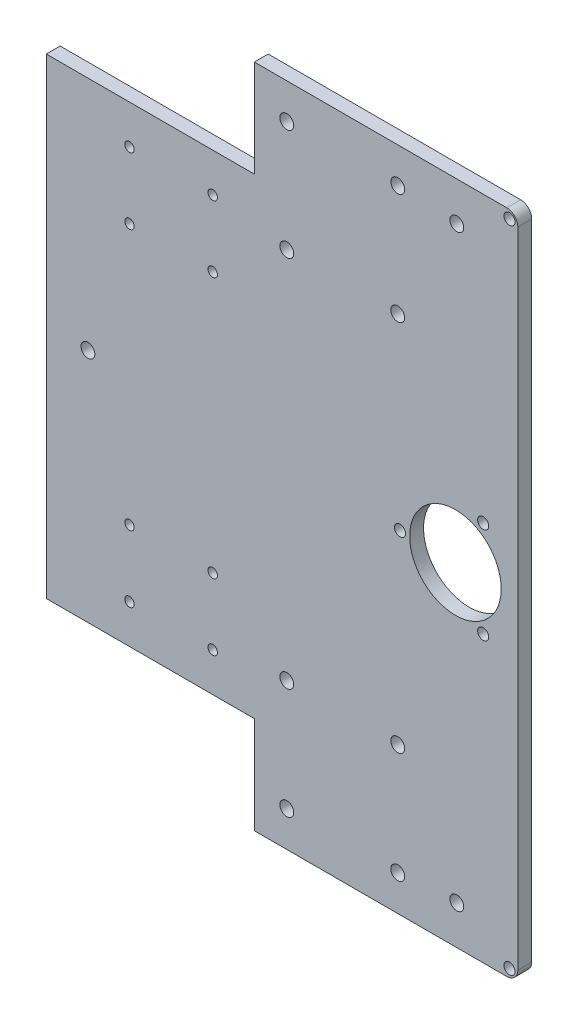
ISO-10303-21;
HEADER;
FILE_DESCRIPTION(('STEP AP214'),'2;1');
FILE_NAME('part.step','',(''),(''),'','','');
FILE_SCHEMA(('AUTOMOTIVE_DESIGN { 1 0 10303 214 1 1 1 1 }'));
ENDSEC;
DATA;
#1=APPLICATION_CONTEXT('core data for automotive mechanical design processes');
#2=APPLICATION_PROTOCOL_DEFINITION('international standard','automotive_design',2000,#1);
#3=PRODUCT_CONTEXT('',#1,'mechanical');
#4=PRODUCT('Part','Part','',(#3));
#5=PRODUCT_RELATED_PRODUCT_CATEGORY('part','',(#4));
#6=PRODUCT_DEFINITION_FORMATION('','',#4);
#7=PRODUCT_DEFINITION_CONTEXT('part definition',#1,'design');
#8=PRODUCT_DEFINITION('design','',#6,#7);
#9=PRODUCT_DEFINITION_SHAPE('','',#8);
#10=(LENGTH_UNIT() NAMED_UNIT(*) SI_UNIT(.MILLI.,.METRE.));
#11=(NAMED_UNIT(*) PLANE_ANGLE_UNIT() SI_UNIT($,.RADIAN.));
#12=(NAMED_UNIT(*) SI_UNIT($,.STERADIAN.) SOLID_ANGLE_UNIT());
#13=UNCERTAINTY_MEASURE_WITH_UNIT(LENGTH_MEASURE(1.E-05),#10,'distance_accuracy_value','');
#14=(GEOMETRIC_REPRESENTATION_CONTEXT(3) GLOBAL_UNCERTAINTY_ASSIGNED_CONTEXT((#13)) GLOBAL_UNIT_ASSIGNED_CONTEXT((#10,
#11,#12)) REPRESENTATION_CONTEXT('',''));
#15=CARTESIAN_POINT('',(0.,0.,0.));
#16=DIRECTION('',(0.,0.,1.));
#17=DIRECTION('',(1.,0.,0.));
#18=AXIS2_PLACEMENT_3D('',#15,#16,#17);
#19=CARTESIAN_POINT('',(85.,120.,5.));
#20=DIRECTION('',(-1.,0.,0.));
#21=DIRECTION('',(0.,0.,1.));
#22=AXIS2_PLACEMENT_3D('',#19,#20,#21);
#23=PLANE('',#22);
#24=DIRECTION('',(0.,1.,0.));
#25=VECTOR('',#24,1.);
#26=CARTESIAN_POINT('',(85.,120.,0.));
#27=LINE('',#26,#25);
#28=CARTESIAN_POINT('',(85.,-116.,0.));
#29=VERTEX_POINT('',#28);
#30=CARTESIAN_POINT('',(85.,116.,0.));
#31=VERTEX_POINT('',#30);
#32=EDGE_CURVE('E119',#29,#31,#27,.T.);
#33=ORIENTED_EDGE('',*,*,#32,.T.);
#34=DIRECTION('',(0.,0.,-1.));
#35=VECTOR('',#34,1.);
#36=CARTESIAN_POINT('',(85.,116.,5.));
#37=LINE('',#36,#35);
#38=CARTESIAN_POINT('',(85.,116.,5.));
#39=VERTEX_POINT('',#38);
#40=EDGE_CURVE('E41',#31,#39,#37,.F.);
#41=ORIENTED_EDGE('',*,*,#40,.T.);
#42=DIRECTION('',(0.,1.,0.));
#43=VECTOR('',#42,1.);
#44=CARTESIAN_POINT('',(85.,120.,5.));
#45=LINE('',#44,#43);
#46=CARTESIAN_POINT('',(85.,-116.,5.));
#47=VERTEX_POINT('',#46);
#48=EDGE_CURVE('E238',#47,#39,#45,.T.);
#49=ORIENTED_EDGE('',*,*,#48,.F.);
#50=DIRECTION('',(0.,0.,-1.));
#51=VECTOR('',#50,1.);
#52=CARTESIAN_POINT('',(85.,-116.,5.));
#53=LINE('',#52,#51);
#54=EDGE_CURVE('E249',#47,#29,#53,.T.);
#55=ORIENTED_EDGE('',*,*,#54,.T.);
#56=EDGE_LOOP('',(#33,#41,#49,#55));
#57=FACE_BOUND('',#56,.T.);
#58=ADVANCED_FACE('F33',(#57),#23,.F.);
#59=CARTESIAN_POINT('',(-85.,120.,5.));
#60=DIRECTION('',(0.,-1.,0.));
#61=DIRECTION('',(0.,0.,-1.));
#62=AXIS2_PLACEMENT_3D('',#59,#60,#61);
#63=PLANE('',#62);
#64=DIRECTION('',(-1.,0.,0.));
#65=VECTOR('',#64,1.);
#66=CARTESIAN_POINT('',(-85.,120.,5.));
#67=LINE('',#66,#65);
#68=CARTESIAN_POINT('',(81.,120.,5.));
#69=VERTEX_POINT('',#68);
#70=CARTESIAN_POINT('',(-10.,120.,5.));
#71=VERTEX_POINT('',#70);
#72=EDGE_CURVE('E240',#69,#71,#67,.T.);
#73=ORIENTED_EDGE('',*,*,#72,.F.);
#74=DIRECTION('',(0.,0.,-1.));
#75=VECTOR('',#74,1.);
#76=CARTESIAN_POINT('',(81.,120.,5.));
#77=LINE('',#76,#75);
#78=CARTESIAN_POINT('',(81.,120.,0.));
#79=VERTEX_POINT('',#78);
#80=EDGE_CURVE('E116',#69,#79,#77,.T.);
#81=ORIENTED_EDGE('',*,*,#80,.T.);
#82=DIRECTION('',(-1.,0.,0.));
#83=VECTOR('',#82,1.);
#84=CARTESIAN_POINT('',(-85.,120.,0.));
#85=LINE('',#84,#83);
#86=CARTESIAN_POINT('',(-10.,120.,0.));
#87=VERTEX_POINT('',#86);
#88=EDGE_CURVE('E110',#79,#87,#85,.T.);
#89=ORIENTED_EDGE('',*,*,#88,.T.);
#90=DIRECTION('',(0.,0.,1.));
#91=VECTOR('',#90,1.);
#92=CARTESIAN_POINT('',(-10.,120.,0.));
#93=LINE('',#92,#91);
#94=EDGE_CURVE('E114',#87,#71,#93,.T.);
#95=ORIENTED_EDGE('',*,*,#94,.T.);
#96=EDGE_LOOP('',(#73,#81,#89,#95));
#97=FACE_BOUND('',#96,.T.);
#98=ADVANCED_FACE('F113',(#97),#63,.F.);
#99=CARTESIAN_POINT('',(-85.,120.,5.));
#100=DIRECTION('',(1.,0.,0.));
#101=DIRECTION('',(0.,1.,0.));
#102=AXIS2_PLACEMENT_3D('',#99,#100,#101);
#103=PLANE('',#102);
#104=DIRECTION('',(0.,-1.,0.));
#105=VECTOR('',#104,1.);
#106=CARTESIAN_POINT('',(-85.,120.,5.));
#107=LINE('',#106,#105);
#108=CARTESIAN_POINT('',(-85.,85.,5.));
#109=VERTEX_POINT('',#108);
#110=CARTESIAN_POINT('',(-85.,-85.,5.));
#111=VERTEX_POINT('',#110);
#112=EDGE_CURVE('E243',#109,#111,#107,.T.);
#113=ORIENTED_EDGE('',*,*,#112,.F.);
#114=DIRECTION('',(0.,0.,1.));
#115=VECTOR('',#114,1.);
#116=CARTESIAN_POINT('',(-85.,85.,0.));
#117=LINE('',#116,#115);
#118=CARTESIAN_POINT('',(-85.,85.,0.));
#119=VERTEX_POINT('',#118);
#120=EDGE_CURVE('E128',#119,#109,#117,.T.);
#121=ORIENTED_EDGE('',*,*,#120,.F.);
#122=DIRECTION('',(0.,-1.,0.));
#123=VECTOR('',#122,1.);
#124=CARTESIAN_POINT('',(-85.,120.,0.));
#125=LINE('',#124,#123);
#126=CARTESIAN_POINT('',(-85.,-85.,0.));
#127=VERTEX_POINT('',#126);
#128=EDGE_CURVE('E118',#119,#127,#125,.T.);
#129=ORIENTED_EDGE('',*,*,#128,.T.);
#130=DIRECTION('',(0.,0.,1.));
#131=VECTOR('',#130,1.);
#132=CARTESIAN_POINT('',(-85.,-85.,0.));
#133=LINE('',#132,#131);
#134=EDGE_CURVE('E163',#127,#111,#133,.T.);
#135=ORIENTED_EDGE('',*,*,#134,.T.);
#136=EDGE_LOOP('',(#113,#121,#129,#135));
#137=FACE_BOUND('',#136,.T.);
#138=ADVANCED_FACE('F288',(#137),#103,.F.);
#139=CARTESIAN_POINT('',(-85.,-120.,5.));
#140=DIRECTION('',(0.,1.,0.));
#141=DIRECTION('',(0.,0.,1.));
#142=AXIS2_PLACEMENT_3D('',#139,#140,#141);
#143=PLANE('',#142);
#144=DIRECTION('',(1.,0.,0.));
#145=VECTOR('',#144,1.);
#146=CARTESIAN_POINT('',(-85.,-120.,0.));
#147=LINE('',#146,#145);
#148=CARTESIAN_POINT('',(-10.,-120.,0.));
#149=VERTEX_POINT('',#148);
#150=CARTESIAN_POINT('',(81.,-120.,0.));
#151=VERTEX_POINT('',#150);
#152=EDGE_CURVE('E241',#149,#151,#147,.T.);
#153=ORIENTED_EDGE('',*,*,#152,.T.);
#154=DIRECTION('',(0.,0.,-1.));
#155=VECTOR('',#154,1.);
#156=CARTESIAN_POINT('',(81.,-120.,5.));
#157=LINE('',#156,#155);
#158=CARTESIAN_POINT('',(81.,-120.,5.));
#159=VERTEX_POINT('',#158);
#160=EDGE_CURVE('E259',#151,#159,#157,.F.);
#161=ORIENTED_EDGE('',*,*,#160,.T.);
#162=DIRECTION('',(1.,0.,0.));
#163=VECTOR('',#162,1.);
#164=CARTESIAN_POINT('',(-85.,-120.,5.));
#165=LINE('',#164,#163);
#166=CARTESIAN_POINT('',(-10.,-120.,5.));
#167=VERTEX_POINT('',#166);
#168=EDGE_CURVE('E246',#167,#159,#165,.T.);
#169=ORIENTED_EDGE('',*,*,#168,.F.);
#170=DIRECTION('',(0.,0.,1.));
#171=VECTOR('',#170,1.);
#172=CARTESIAN_POINT('',(-10.,-120.,0.));
#173=LINE('',#172,#171);
#174=EDGE_CURVE('E143',#149,#167,#173,.T.);
#175=ORIENTED_EDGE('',*,*,#174,.F.);
#176=EDGE_LOOP('',(#153,#161,#169,#175));
#177=FACE_BOUND('',#176,.T.);
#178=ADVANCED_FACE('F278',(#177),#143,.F.);
#179=CARTESIAN_POINT('',(0.,0.,5.));
#180=DIRECTION('',(0.,0.,1.));
#181=DIRECTION('',(1.,0.,0.));
#182=AXIS2_PLACEMENT_3D('',#179,#180,#181);
#183=PLANE('',#182);
#184=CARTESIAN_POINT('',(62.9999999999836,105.99999999999,5.));
#185=DIRECTION('',(0.,0.,-1.));
#186=DIRECTION('',(-1.,0.,0.));
#187=AXIS2_PLACEMENT_3D('',#184,#185,#186);
#188=CIRCLE('',#187,2.49999999998859);
#189=CARTESIAN_POINT('',(60.499999999995,105.99999999999,5.));
#190=VERTEX_POINT('',#189);
#191=EDGE_CURVE('E596',#190,#190,#188,.T.);
#192=ORIENTED_EDGE('',*,*,#191,.T.);
#193=EDGE_LOOP('',(#192));
#194=FACE_BOUND('',#193,.T.);
#195=CARTESIAN_POINT('',(62.9999999999836,-105.99999999999,5.));
#196=DIRECTION('',(0.,0.,-1.));
#197=DIRECTION('',(-1.,0.,0.));
#198=AXIS2_PLACEMENT_3D('',#195,#196,#197);
#199=CIRCLE('',#198,2.5);
#200=CARTESIAN_POINT('',(60.4999999999836,-105.99999999999,5.));
#201=VERTEX_POINT('',#200);
#202=EDGE_CURVE('E600',#201,#201,#199,.T.);
#203=ORIENTED_EDGE('',*,*,#202,.T.);
#204=EDGE_LOOP('',(#203));
#205=FACE_BOUND('',#204,.T.);
#206=CARTESIAN_POINT('',(-69.9999999999836,-3.0158167629857E-12,5.));
#207=DIRECTION('',(0.,0.,-1.));
#208=DIRECTION('',(-1.,0.,0.));
#209=AXIS2_PLACEMENT_3D('',#206,#207,#208);
#210=CIRCLE('',#209,2.50000000000001);
#211=CARTESIAN_POINT('',(-72.4999999999836,-3.0158167629857E-12,5.));
#212=VERTEX_POINT('',#211);
#213=EDGE_CURVE('E610',#212,#212,#210,.T.);
#214=ORIENTED_EDGE('',*,*,#213,.T.);
#215=EDGE_LOOP('',(#214));
#216=FACE_BOUND('',#215,.T.);
#217=CARTESIAN_POINT('',(41.7,-107.25,5.));
#218=DIRECTION('',(0.,0.,1.));
#219=DIRECTION('',(1.,0.,0.));
#220=AXIS2_PLACEMENT_3D('',#217,#218,#219);
#221=CIRCLE('',#220,2.50000000000003);
#222=CARTESIAN_POINT('',(44.2,-107.25,5.));
#223=VERTEX_POINT('',#222);
#224=EDGE_CURVE('E619',#223,#223,#221,.T.);
#225=ORIENTED_EDGE('',*,*,#224,.F.);
#226=EDGE_LOOP('',(#225));
#227=FACE_BOUND('',#226,.T.);
#228=CARTESIAN_POINT('',(1.7,107.25,5.));
#229=DIRECTION('',(0.,0.,1.));
#230=DIRECTION('',(1.,0.,0.));
#231=AXIS2_PLACEMENT_3D('',#228,#229,#230);
#232=CIRCLE('',#231,2.5);
#233=CARTESIAN_POINT('',(4.2,107.25,5.));
#234=VERTEX_POINT('',#233);
#235=EDGE_CURVE('E638',#234,#234,#232,.T.);
#236=ORIENTED_EDGE('',*,*,#235,.F.);
#237=EDGE_LOOP('',(#236));
#238=FACE_BOUND('',#237,.T.);
#239=CARTESIAN_POINT('',(1.7,67.25,5.));
#240=DIRECTION('',(0.,0.,1.));
#241=DIRECTION('',(1.,0.,0.));
#242=AXIS2_PLACEMENT_3D('',#239,#240,#241);
#243=CIRCLE('',#242,2.5);
#244=CARTESIAN_POINT('',(4.2,67.25,5.));
#245=VERTEX_POINT('',#244);
#246=EDGE_CURVE('E637',#245,#245,#243,.T.);
#247=ORIENTED_EDGE('',*,*,#246,.F.);
#248=EDGE_LOOP('',(#247));
#249=FACE_BOUND('',#248,.T.);
#250=CARTESIAN_POINT('',(41.7,67.25,5.));
#251=DIRECTION('',(0.,0.,1.));
#252=DIRECTION('',(1.,0.,0.));
#253=AXIS2_PLACEMENT_3D('',#250,#251,#252);
#254=CIRCLE('',#253,2.5);
#255=CARTESIAN_POINT('',(44.2,67.25,5.));
#256=VERTEX_POINT('',#255);
#257=EDGE_CURVE('E650',#256,#256,#254,.T.);
#258=ORIENTED_EDGE('',*,*,#257,.F.);
#259=EDGE_LOOP('',(#258));
#260=FACE_BOUND('',#259,.T.);
#261=CARTESIAN_POINT('',(1.70000000000001,-107.25,5.));
#262=DIRECTION('',(0.,0.,1.));
#263=DIRECTION('',(1.,0.,0.));
#264=AXIS2_PLACEMENT_3D('',#261,#262,#263);
#265=CIRCLE('',#264,2.50000000000003);
#266=CARTESIAN_POINT('',(4.20000000000004,-107.25,5.));
#267=VERTEX_POINT('',#266);
#268=EDGE_CURVE('E620',#267,#267,#265,.T.);
#269=ORIENTED_EDGE('',*,*,#268,.F.);
#270=EDGE_LOOP('',(#269));
#271=FACE_BOUND('',#270,.T.);
#272=CARTESIAN_POINT('',(1.70000000000001,-67.2499999999999,5.));
#273=DIRECTION('',(0.,0.,1.));
#274=DIRECTION('',(1.,0.,0.));
#275=AXIS2_PLACEMENT_3D('',#272,#273,#274);
#276=CIRCLE('',#275,2.50000000000003);
#277=CARTESIAN_POINT('',(4.20000000000004,-67.2499999999999,5.));
#278=VERTEX_POINT('',#277);
#279=EDGE_CURVE('E626',#278,#278,#276,.T.);
#280=ORIENTED_EDGE('',*,*,#279,.F.);
#281=EDGE_LOOP('',(#280));
#282=FACE_BOUND('',#281,.T.);
#283=CARTESIAN_POINT('',(41.7,-67.2499999999999,5.));
#284=DIRECTION('',(0.,0.,1.));
#285=DIRECTION('',(1.,0.,0.));
#286=AXIS2_PLACEMENT_3D('',#283,#284,#285);
#287=CIRCLE('',#286,2.50000000000003);
#288=CARTESIAN_POINT('',(44.2,-67.2499999999999,5.));
#289=VERTEX_POINT('',#288);
#290=EDGE_CURVE('E602',#289,#289,#287,.T.);
#291=ORIENTED_EDGE('',*,*,#290,.F.);
#292=EDGE_LOOP('',(#291));
#293=FACE_BOUND('',#292,.T.);
#294=CARTESIAN_POINT('',(41.7,107.25,5.));
#295=DIRECTION('',(0.,0.,1.));
#296=DIRECTION('',(1.,0.,0.));
#297=AXIS2_PLACEMENT_3D('',#294,#295,#296);
#298=CIRCLE('',#297,2.5);
#299=CARTESIAN_POINT('',(44.2,107.25,5.));
#300=VERTEX_POINT('',#299);
#301=EDGE_CURVE('E649',#300,#300,#298,.T.);
#302=ORIENTED_EDGE('',*,*,#301,.F.);
#303=EDGE_LOOP('',(#302));
#304=FACE_BOUND('',#303,.T.);
#305=CARTESIAN_POINT('',(81.9999999993819,117.,5.));
#306=DIRECTION('',(0.,0.,-1.));
#307=DIRECTION('',(1.,0.,0.));
#308=AXIS2_PLACEMENT_3D('',#305,#306,#307);
#309=CIRCLE('',#308,2.0000000005911);
#310=CARTESIAN_POINT('',(83.999999999973,117.,5.));
#311=VERTEX_POINT('',#310);
#312=EDGE_CURVE('E661',#311,#311,#309,.T.);
#313=ORIENTED_EDGE('',*,*,#312,.T.);
#314=EDGE_LOOP('',(#313));
#315=FACE_BOUND('',#314,.T.);
#316=CARTESIAN_POINT('',(81.9999999993819,-117.,5.));
#317=DIRECTION('',(0.,0.,1.));
#318=DIRECTION('',(1.,0.,0.));
#319=AXIS2_PLACEMENT_3D('',#316,#317,#318);
#320=CIRCLE('',#319,2.0000000005911);
#321=CARTESIAN_POINT('',(83.999999999973,-117.,5.));
#322=VERTEX_POINT('',#321);
#323=EDGE_CURVE('E140',#322,#322,#320,.T.);
#324=ORIENTED_EDGE('',*,*,#323,.F.);
#325=EDGE_LOOP('',(#324));
#326=FACE_BOUND('',#325,.T.);
#327=ORIENTED_EDGE('',*,*,#48,.T.);
#328=CARTESIAN_POINT('',(81.,116.,5.));
#329=DIRECTION('',(0.,0.,1.));
#330=DIRECTION('',(1.,0.,0.));
#331=AXIS2_PLACEMENT_3D('',#328,#329,#330);
#332=CIRCLE('',#331,4.);
#333=EDGE_CURVE('E11',#39,#69,#332,.T.);
#334=ORIENTED_EDGE('',*,*,#333,.T.);
#335=ORIENTED_EDGE('',*,*,#72,.T.);
#336=DIRECTION('',(0.,1.,0.));
#337=VECTOR('',#336,1.);
#338=CARTESIAN_POINT('',(-10.,120.,5.));
#339=LINE('',#338,#337);
#340=CARTESIAN_POINT('',(-10.,85.,5.));
#341=VERTEX_POINT('',#340);
#342=EDGE_CURVE('E127',#341,#71,#339,.T.);
#343=ORIENTED_EDGE('',*,*,#342,.F.);
#344=DIRECTION('',(1.,0.,0.));
#345=VECTOR('',#344,1.);
#346=CARTESIAN_POINT('',(-10.,85.,5.));
#347=LINE('',#346,#345);
#348=EDGE_CURVE('E134',#109,#341,#347,.T.);
#349=ORIENTED_EDGE('',*,*,#348,.F.);
#350=ORIENTED_EDGE('',*,*,#112,.T.);
#351=DIRECTION('',(-1.,0.,0.));
#352=VECTOR('',#351,1.);
#353=CARTESIAN_POINT('',(-10.,-85.,5.));
#354=LINE('',#353,#352);
#355=CARTESIAN_POINT('',(-10.,-85.,5.));
#356=VERTEX_POINT('',#355);
#357=EDGE_CURVE('E153',#356,#111,#354,.T.);
#358=ORIENTED_EDGE('',*,*,#357,.F.);
#359=DIRECTION('',(0.,1.,0.));
#360=VECTOR('',#359,1.);
#361=CARTESIAN_POINT('',(-10.,-120.,5.));
#362=LINE('',#361,#360);
#363=EDGE_CURVE('E157',#167,#356,#362,.T.);
#364=ORIENTED_EDGE('',*,*,#363,.F.);
#365=ORIENTED_EDGE('',*,*,#168,.T.);
#366=CARTESIAN_POINT('',(81.,-116.,5.));
#367=DIRECTION('',(0.,0.,1.));
#368=DIRECTION('',(1.,0.,0.));
#369=AXIS2_PLACEMENT_3D('',#366,#367,#368);
#370=CIRCLE('',#369,4.);
#371=EDGE_CURVE('E261',#159,#47,#370,.T.);
#372=ORIENTED_EDGE('',*,*,#371,.T.);
#373=EDGE_LOOP('',(#327,#334,#335,#343,#349,#350,#358,#364,#365,#372));
#374=FACE_BOUND('',#373,.T.);
#375=CARTESIAN_POINT('',(-55.,-71.,5.));
#376=DIRECTION('',(0.,0.,1.));
#377=DIRECTION('',(-1.,0.,0.));
#378=AXIS2_PLACEMENT_3D('',#375,#376,#377);
#379=CIRCLE('',#378,1.70000000000013);
#380=CARTESIAN_POINT('',(-56.7000000000002,-71.,5.));
#381=VERTEX_POINT('',#380);
#382=EDGE_CURVE('E176',#381,#381,#379,.T.);
#383=ORIENTED_EDGE('',*,*,#382,.F.);
#384=EDGE_LOOP('',(#383));
#385=FACE_BOUND('',#384,.T.);
#386=CARTESIAN_POINT('',(-55.,71.,5.));
#387=DIRECTION('',(0.,0.,1.));
#388=DIRECTION('',(1.,0.,0.));
#389=AXIS2_PLACEMENT_3D('',#386,#387,#388);
#390=CIRCLE('',#389,1.7000000000001);
#391=CARTESIAN_POINT('',(-53.2999999999999,71.,5.));
#392=VERTEX_POINT('',#391);
#393=EDGE_CURVE('E189',#392,#392,#390,.T.);
#394=ORIENTED_EDGE('',*,*,#393,.F.);
#395=EDGE_LOOP('',(#394));
#396=FACE_BOUND('',#395,.T.);
#397=CARTESIAN_POINT('',(-55.,47.,5.));
#398=DIRECTION('',(0.,0.,1.));
#399=DIRECTION('',(1.,0.,0.));
#400=AXIS2_PLACEMENT_3D('',#397,#398,#399);
#401=CIRCLE('',#400,1.7000000000001);
#402=CARTESIAN_POINT('',(-53.3,47.,5.));
#403=VERTEX_POINT('',#402);
#404=EDGE_CURVE('E188',#403,#403,#401,.T.);
#405=ORIENTED_EDGE('',*,*,#404,.F.);
#406=EDGE_LOOP('',(#405));
#407=FACE_BOUND('',#406,.T.);
#408=CARTESIAN_POINT('',(-25.,71.,5.));
#409=DIRECTION('',(0.,0.,1.));
#410=DIRECTION('',(1.,0.,0.));
#411=AXIS2_PLACEMENT_3D('',#408,#409,#410);
#412=CIRCLE('',#411,1.70000000000012);
#413=CARTESIAN_POINT('',(-23.2999999999999,71.,5.));
#414=VERTEX_POINT('',#413);
#415=EDGE_CURVE('E201',#414,#414,#412,.T.);
#416=ORIENTED_EDGE('',*,*,#415,.F.);
#417=EDGE_LOOP('',(#416));
#418=FACE_BOUND('',#417,.T.);
#419=CARTESIAN_POINT('',(-25.0000000000001,-47.,5.));
#420=DIRECTION('',(0.,0.,1.));
#421=DIRECTION('',(-1.,0.,0.));
#422=AXIS2_PLACEMENT_3D('',#419,#420,#421);
#423=CIRCLE('',#422,1.70000000000016);
#424=CARTESIAN_POINT('',(-26.7000000000002,-47.,5.));
#425=VERTEX_POINT('',#424);
#426=EDGE_CURVE('E147',#425,#425,#423,.T.);
#427=ORIENTED_EDGE('',*,*,#426,.F.);
#428=EDGE_LOOP('',(#427));
#429=FACE_BOUND('',#428,.T.);
#430=CARTESIAN_POINT('',(-55.,-47.,5.));
#431=DIRECTION('',(0.,0.,1.));
#432=DIRECTION('',(-1.,0.,0.));
#433=AXIS2_PLACEMENT_3D('',#430,#431,#432);
#434=CIRCLE('',#433,1.70000000000013);
#435=CARTESIAN_POINT('',(-56.7000000000002,-47.,5.));
#436=VERTEX_POINT('',#435);
#437=EDGE_CURVE('E170',#436,#436,#434,.T.);
#438=ORIENTED_EDGE('',*,*,#437,.F.);
#439=EDGE_LOOP('',(#438));
#440=FACE_BOUND('',#439,.T.);
#441=CARTESIAN_POINT('',(-25.,-71.,5.));
#442=DIRECTION('',(0.,0.,1.));
#443=DIRECTION('',(-1.,0.,0.));
#444=AXIS2_PLACEMENT_3D('',#441,#442,#443);
#445=CIRCLE('',#444,1.70000000000015);
#446=CARTESIAN_POINT('',(-26.7000000000002,-71.,5.));
#447=VERTEX_POINT('',#446);
#448=EDGE_CURVE('E177',#447,#447,#445,.T.);
#449=ORIENTED_EDGE('',*,*,#448,.F.);
#450=EDGE_LOOP('',(#449));
#451=FACE_BOUND('',#450,.T.);
#452=CARTESIAN_POINT('',(-25.0000000000001,47.,5.));
#453=DIRECTION('',(0.,0.,1.));
#454=DIRECTION('',(1.,0.,0.));
#455=AXIS2_PLACEMENT_3D('',#452,#453,#454);
#456=CIRCLE('',#455,1.70000000000013);
#457=CARTESIAN_POINT('',(-23.2999999999999,47.,5.));
#458=VERTEX_POINT('',#457);
#459=EDGE_CURVE('E200',#458,#458,#456,.T.);
#460=ORIENTED_EDGE('',*,*,#459,.F.);
#461=EDGE_LOOP('',(#460));
#462=FACE_BOUND('',#461,.T.);
#463=CARTESIAN_POINT('',(72.5,-17.3205080756889,5.));
#464=DIRECTION('',(0.,0.,1.));
#465=DIRECTION('',(1.,0.,0.));
#466=AXIS2_PLACEMENT_3D('',#463,#464,#465);
#467=CIRCLE('',#466,2.00000000000001);
#468=CARTESIAN_POINT('',(74.5,-17.3205080756889,5.));
#469=VERTEX_POINT('',#468);
#470=EDGE_CURVE('E219',#469,#469,#467,.T.);
#471=ORIENTED_EDGE('',*,*,#470,.F.);
#472=EDGE_LOOP('',(#471));
#473=FACE_BOUND('',#472,.T.);
#474=CARTESIAN_POINT('',(72.5,17.3205080756887,5.));
#475=DIRECTION('',(0.,0.,1.));
#476=DIRECTION('',(1.,0.,0.));
#477=AXIS2_PLACEMENT_3D('',#474,#475,#476);
#478=CIRCLE('',#477,2.);
#479=CARTESIAN_POINT('',(74.5,17.3205080756887,5.));
#480=VERTEX_POINT('',#479);
#481=EDGE_CURVE('E225',#480,#480,#478,.T.);
#482=ORIENTED_EDGE('',*,*,#481,.F.);
#483=EDGE_LOOP('',(#482));
#484=FACE_BOUND('',#483,.T.);
#485=CARTESIAN_POINT('',(42.5,0.,5.));
#486=DIRECTION('',(0.,0.,1.));
#487=DIRECTION('',(1.,0.,0.));
#488=AXIS2_PLACEMENT_3D('',#485,#486,#487);
#489=CIRCLE('',#488,2.);
#490=CARTESIAN_POINT('',(44.5,0.,5.));
#491=VERTEX_POINT('',#490);
#492=EDGE_CURVE('E212',#491,#491,#489,.T.);
#493=ORIENTED_EDGE('',*,*,#492,.F.);
#494=EDGE_LOOP('',(#493));
#495=FACE_BOUND('',#494,.T.);
#496=CARTESIAN_POINT('',(62.5,-1.11022302462516E-13,5.));
#497=DIRECTION('',(0.,0.,1.));
#498=DIRECTION('',(1.,0.,0.));
#499=AXIS2_PLACEMENT_3D('',#496,#497,#498);
#500=CIRCLE('',#499,16.5);
#501=CARTESIAN_POINT('',(79.,-1.11022302462516E-13,5.));
#502=VERTEX_POINT('',#501);
#503=EDGE_CURVE('E218',#502,#502,#500,.T.);
#504=ORIENTED_EDGE('',*,*,#503,.F.);
#505=EDGE_LOOP('',(#504));
#506=FACE_BOUND('',#505,.T.);
#507=ADVANCED_FACE('F266',(#194,#205,#216,#227,#238,#249,#260,#271,#282,#293,#304,#315,#326,
#374,#385,#396,#407,#418,#429,#440,#451,#462,#473,#484,#495,#506),#183,.T.);
#508=CARTESIAN_POINT('',(0.,0.,0.));
#509=DIRECTION('',(0.,0.,1.));
#510=DIRECTION('',(1.,0.,0.));
#511=AXIS2_PLACEMENT_3D('',#508,#509,#510);
#512=PLANE('',#511);
#513=CARTESIAN_POINT('',(62.9999999999836,105.99999999999,0.));
#514=DIRECTION('',(0.,0.,-1.));
#515=DIRECTION('',(-1.,0.,0.));
#516=AXIS2_PLACEMENT_3D('',#513,#514,#515);
#517=CIRCLE('',#516,2.49999999998859);
#518=CARTESIAN_POINT('',(60.499999999995,105.99999999999,0.));
#519=VERTEX_POINT('',#518);
#520=EDGE_CURVE('E599',#519,#519,#517,.T.);
#521=ORIENTED_EDGE('',*,*,#520,.F.);
#522=EDGE_LOOP('',(#521));
#523=FACE_BOUND('',#522,.T.);
#524=CARTESIAN_POINT('',(62.9999999999836,-105.99999999999,0.));
#525=DIRECTION('',(0.,0.,-1.));
#526=DIRECTION('',(-1.,0.,0.));
#527=AXIS2_PLACEMENT_3D('',#524,#525,#526);
#528=CIRCLE('',#527,2.5);
#529=CARTESIAN_POINT('',(60.4999999999836,-105.99999999999,0.));
#530=VERTEX_POINT('',#529);
#531=EDGE_CURVE('E605',#530,#530,#528,.T.);
#532=ORIENTED_EDGE('',*,*,#531,.F.);
#533=EDGE_LOOP('',(#532));
#534=FACE_BOUND('',#533,.T.);
#535=CARTESIAN_POINT('',(-69.9999999999836,-3.0158167629857E-12,0.));
#536=DIRECTION('',(0.,0.,-1.));
#537=DIRECTION('',(-1.,0.,0.));
#538=AXIS2_PLACEMENT_3D('',#535,#536,#537);
#539=CIRCLE('',#538,2.50000000000001);
#540=CARTESIAN_POINT('',(-72.4999999999836,-3.0158167629857E-12,0.));
#541=VERTEX_POINT('',#540);
#542=EDGE_CURVE('E613',#541,#541,#539,.T.);
#543=ORIENTED_EDGE('',*,*,#542,.F.);
#544=EDGE_LOOP('',(#543));
#545=FACE_BOUND('',#544,.T.);
#546=CARTESIAN_POINT('',(41.7,-107.25,0.));
#547=DIRECTION('',(0.,0.,1.));
#548=DIRECTION('',(1.,0.,0.));
#549=AXIS2_PLACEMENT_3D('',#546,#547,#548);
#550=CIRCLE('',#549,2.50000000000003);
#551=CARTESIAN_POINT('',(44.2,-107.25,0.));
#552=VERTEX_POINT('',#551);
#553=EDGE_CURVE('E641',#552,#552,#550,.T.);
#554=ORIENTED_EDGE('',*,*,#553,.T.);
#555=EDGE_LOOP('',(#554));
#556=FACE_BOUND('',#555,.T.);
#557=CARTESIAN_POINT('',(1.7,107.25,0.));
#558=DIRECTION('',(0.,0.,1.));
#559=DIRECTION('',(1.,0.,0.));
#560=AXIS2_PLACEMENT_3D('',#557,#558,#559);
#561=CIRCLE('',#560,2.5);
#562=CARTESIAN_POINT('',(4.2,107.25,0.));
#563=VERTEX_POINT('',#562);
#564=EDGE_CURVE('E634',#563,#563,#561,.T.);
#565=ORIENTED_EDGE('',*,*,#564,.T.);
#566=EDGE_LOOP('',(#565));
#567=FACE_BOUND('',#566,.T.);
#568=CARTESIAN_POINT('',(1.7,67.25,0.));
#569=DIRECTION('',(0.,0.,1.));
#570=DIRECTION('',(1.,0.,0.));
#571=AXIS2_PLACEMENT_3D('',#568,#569,#570);
#572=CIRCLE('',#571,2.5);
#573=CARTESIAN_POINT('',(4.2,67.25,0.));
#574=VERTEX_POINT('',#573);
#575=EDGE_CURVE('E653',#574,#574,#572,.T.);
#576=ORIENTED_EDGE('',*,*,#575,.T.);
#577=EDGE_LOOP('',(#576));
#578=FACE_BOUND('',#577,.T.);
#579=CARTESIAN_POINT('',(41.7,67.25,0.));
#580=DIRECTION('',(0.,0.,1.));
#581=DIRECTION('',(1.,0.,0.));
#582=AXIS2_PLACEMENT_3D('',#579,#580,#581);
#583=CIRCLE('',#582,2.5);
#584=CARTESIAN_POINT('',(44.2,67.25,0.));
#585=VERTEX_POINT('',#584);
#586=EDGE_CURVE('E646',#585,#585,#583,.T.);
#587=ORIENTED_EDGE('',*,*,#586,.T.);
#588=EDGE_LOOP('',(#587));
#589=FACE_BOUND('',#588,.T.);
#590=CARTESIAN_POINT('',(1.70000000000001,-107.25,0.));
#591=DIRECTION('',(0.,0.,1.));
#592=DIRECTION('',(1.,0.,0.));
#593=AXIS2_PLACEMENT_3D('',#590,#591,#592);
#594=CIRCLE('',#593,2.50000000000003);
#595=CARTESIAN_POINT('',(4.20000000000004,-107.25,0.));
#596=VERTEX_POINT('',#595);
#597=EDGE_CURVE('E616',#596,#596,#594,.T.);
#598=ORIENTED_EDGE('',*,*,#597,.T.);
#599=EDGE_LOOP('',(#598));
#600=FACE_BOUND('',#599,.T.);
#601=CARTESIAN_POINT('',(1.70000000000001,-67.2499999999999,0.));
#602=DIRECTION('',(0.,0.,1.));
#603=DIRECTION('',(1.,0.,0.));
#604=AXIS2_PLACEMENT_3D('',#601,#602,#603);
#605=CIRCLE('',#604,2.50000000000003);
#606=CARTESIAN_POINT('',(4.20000000000004,-67.2499999999999,0.));
#607=VERTEX_POINT('',#606);
#608=EDGE_CURVE('E623',#607,#607,#605,.T.);
#609=ORIENTED_EDGE('',*,*,#608,.T.);
#610=EDGE_LOOP('',(#609));
#611=FACE_BOUND('',#610,.T.);
#612=CARTESIAN_POINT('',(41.7,-67.2499999999999,0.));
#613=DIRECTION('',(0.,0.,1.));
#614=DIRECTION('',(1.,0.,0.));
#615=AXIS2_PLACEMENT_3D('',#612,#613,#614);
#616=CIRCLE('',#615,2.50000000000003);
#617=CARTESIAN_POINT('',(44.2,-67.2499999999999,0.));
#618=VERTEX_POINT('',#617);
#619=EDGE_CURVE('E629',#618,#618,#616,.T.);
#620=ORIENTED_EDGE('',*,*,#619,.T.);
#621=EDGE_LOOP('',(#620));
#622=FACE_BOUND('',#621,.T.);
#623=CARTESIAN_POINT('',(41.7,107.25,0.));
#624=DIRECTION('',(0.,0.,1.));
#625=DIRECTION('',(1.,0.,0.));
#626=AXIS2_PLACEMENT_3D('',#623,#624,#625);
#627=CIRCLE('',#626,2.5);
#628=CARTESIAN_POINT('',(44.2,107.25,0.));
#629=VERTEX_POINT('',#628);
#630=EDGE_CURVE('E658',#629,#629,#627,.T.);
#631=ORIENTED_EDGE('',*,*,#630,.T.);
#632=EDGE_LOOP('',(#631));
#633=FACE_BOUND('',#632,.T.);
#634=CARTESIAN_POINT('',(81.9999999993819,117.,0.));
#635=DIRECTION('',(0.,0.,-1.));
#636=DIRECTION('',(1.,0.,0.));
#637=AXIS2_PLACEMENT_3D('',#634,#635,#636);
#638=CIRCLE('',#637,2.0000000005911);
#639=CARTESIAN_POINT('',(83.999999999973,117.,0.));
#640=VERTEX_POINT('',#639);
#641=EDGE_CURVE('E664',#640,#640,#638,.T.);
#642=ORIENTED_EDGE('',*,*,#641,.F.);
#643=EDGE_LOOP('',(#642));
#644=FACE_BOUND('',#643,.T.);
#645=CARTESIAN_POINT('',(81.9999999993819,-117.,0.));
#646=DIRECTION('',(0.,0.,1.));
#647=DIRECTION('',(1.,0.,0.));
#648=AXIS2_PLACEMENT_3D('',#645,#646,#647);
#649=CIRCLE('',#648,2.0000000005911);
#650=CARTESIAN_POINT('',(83.999999999973,-117.,0.));
#651=VERTEX_POINT('',#650);
#652=EDGE_CURVE('E160',#651,#651,#649,.T.);
#653=ORIENTED_EDGE('',*,*,#652,.T.);
#654=EDGE_LOOP('',(#653));
#655=FACE_BOUND('',#654,.T.);
#656=CARTESIAN_POINT('',(-55.,-71.,0.));
#657=DIRECTION('',(0.,0.,1.));
#658=DIRECTION('',(-1.,0.,0.));
#659=AXIS2_PLACEMENT_3D('',#656,#657,#658);
#660=CIRCLE('',#659,1.70000000000013);
#661=CARTESIAN_POINT('',(-56.7000000000002,-71.,0.));
#662=VERTEX_POINT('',#661);
#663=EDGE_CURVE('E192',#662,#662,#660,.T.);
#664=ORIENTED_EDGE('',*,*,#663,.T.);
#665=EDGE_LOOP('',(#664));
#666=FACE_BOUND('',#665,.T.);
#667=CARTESIAN_POINT('',(-55.,71.,0.));
#668=DIRECTION('',(0.,0.,1.));
#669=DIRECTION('',(1.,0.,0.));
#670=AXIS2_PLACEMENT_3D('',#667,#668,#669);
#671=CIRCLE('',#670,1.7000000000001);
#672=CARTESIAN_POINT('',(-53.2999999999999,71.,0.));
#673=VERTEX_POINT('',#672);
#674=EDGE_CURVE('E185',#673,#673,#671,.T.);
#675=ORIENTED_EDGE('',*,*,#674,.T.);
#676=EDGE_LOOP('',(#675));
#677=FACE_BOUND('',#676,.T.);
#678=CARTESIAN_POINT('',(-55.,47.,0.));
#679=DIRECTION('',(0.,0.,1.));
#680=DIRECTION('',(1.,0.,0.));
#681=AXIS2_PLACEMENT_3D('',#678,#679,#680);
#682=CIRCLE('',#681,1.7000000000001);
#683=CARTESIAN_POINT('',(-53.3,47.,0.));
#684=VERTEX_POINT('',#683);
#685=EDGE_CURVE('E204',#684,#684,#682,.T.);
#686=ORIENTED_EDGE('',*,*,#685,.T.);
#687=EDGE_LOOP('',(#686));
#688=FACE_BOUND('',#687,.T.);
#689=CARTESIAN_POINT('',(-25.,71.,0.));
#690=DIRECTION('',(0.,0.,1.));
#691=DIRECTION('',(1.,0.,0.));
#692=AXIS2_PLACEMENT_3D('',#689,#690,#691);
#693=CIRCLE('',#692,1.70000000000012);
#694=CARTESIAN_POINT('',(-23.2999999999999,71.,0.));
#695=VERTEX_POINT('',#694);
#696=EDGE_CURVE('E197',#695,#695,#693,.T.);
#697=ORIENTED_EDGE('',*,*,#696,.T.);
#698=EDGE_LOOP('',(#697));
#699=FACE_BOUND('',#698,.T.);
#700=CARTESIAN_POINT('',(-25.0000000000001,-47.,0.));
#701=DIRECTION('',(0.,0.,1.));
#702=DIRECTION('',(-1.,0.,0.));
#703=AXIS2_PLACEMENT_3D('',#700,#701,#702);
#704=CIRCLE('',#703,1.70000000000016);
#705=CARTESIAN_POINT('',(-26.7000000000002,-47.,0.));
#706=VERTEX_POINT('',#705);
#707=EDGE_CURVE('E167',#706,#706,#704,.T.);
#708=ORIENTED_EDGE('',*,*,#707,.T.);
#709=EDGE_LOOP('',(#708));
#710=FACE_BOUND('',#709,.T.);
#711=CARTESIAN_POINT('',(-55.,-47.,0.));
#712=DIRECTION('',(0.,0.,1.));
#713=DIRECTION('',(-1.,0.,0.));
#714=AXIS2_PLACEMENT_3D('',#711,#712,#713);
#715=CIRCLE('',#714,1.70000000000013);
#716=CARTESIAN_POINT('',(-56.7000000000002,-47.,0.));
#717=VERTEX_POINT('',#716);
#718=EDGE_CURVE('E180',#717,#717,#715,.T.);
#719=ORIENTED_EDGE('',*,*,#718,.T.);
#720=EDGE_LOOP('',(#719));
#721=FACE_BOUND('',#720,.T.);
#722=CARTESIAN_POINT('',(-25.,-71.,0.));
#723=DIRECTION('',(0.,0.,1.));
#724=DIRECTION('',(-1.,0.,0.));
#725=AXIS2_PLACEMENT_3D('',#722,#723,#724);
#726=CIRCLE('',#725,1.70000000000015);
#727=CARTESIAN_POINT('',(-26.7000000000002,-71.,0.));
#728=VERTEX_POINT('',#727);
#729=EDGE_CURVE('E173',#728,#728,#726,.T.);
#730=ORIENTED_EDGE('',*,*,#729,.T.);
#731=EDGE_LOOP('',(#730));
#732=FACE_BOUND('',#731,.T.);
#733=CARTESIAN_POINT('',(-25.0000000000001,47.,0.));
#734=DIRECTION('',(0.,0.,1.));
#735=DIRECTION('',(1.,0.,0.));
#736=AXIS2_PLACEMENT_3D('',#733,#734,#735);
#737=CIRCLE('',#736,1.70000000000013);
#738=CARTESIAN_POINT('',(-23.2999999999999,47.,0.));
#739=VERTEX_POINT('',#738);
#740=EDGE_CURVE('E209',#739,#739,#737,.T.);
#741=ORIENTED_EDGE('',*,*,#740,.T.);
#742=EDGE_LOOP('',(#741));
#743=FACE_BOUND('',#742,.T.);
#744=CARTESIAN_POINT('',(72.5,-17.3205080756889,0.));
#745=DIRECTION('',(0.,0.,1.));
#746=DIRECTION('',(1.,0.,0.));
#747=AXIS2_PLACEMENT_3D('',#744,#745,#746);
#748=CIRCLE('',#747,2.00000000000001);
#749=CARTESIAN_POINT('',(74.5,-17.3205080756889,0.));
#750=VERTEX_POINT('',#749);
#751=EDGE_CURVE('E215',#750,#750,#748,.T.);
#752=ORIENTED_EDGE('',*,*,#751,.T.);
#753=EDGE_LOOP('',(#752));
#754=FACE_BOUND('',#753,.T.);
#755=CARTESIAN_POINT('',(72.5,17.3205080756887,0.));
#756=DIRECTION('',(0.,0.,1.));
#757=DIRECTION('',(1.,0.,0.));
#758=AXIS2_PLACEMENT_3D('',#755,#756,#757);
#759=CIRCLE('',#758,2.);
#760=CARTESIAN_POINT('',(74.5,17.3205080756887,0.));
#761=VERTEX_POINT('',#760);
#762=EDGE_CURVE('E222',#761,#761,#759,.T.);
#763=ORIENTED_EDGE('',*,*,#762,.T.);
#764=EDGE_LOOP('',(#763));
#765=FACE_BOUND('',#764,.T.);
#766=CARTESIAN_POINT('',(42.5,0.,0.));
#767=DIRECTION('',(0.,0.,1.));
#768=DIRECTION('',(1.,0.,0.));
#769=AXIS2_PLACEMENT_3D('',#766,#767,#768);
#770=CIRCLE('',#769,2.);
#771=CARTESIAN_POINT('',(44.5,0.,0.));
#772=VERTEX_POINT('',#771);
#773=EDGE_CURVE('E228',#772,#772,#770,.T.);
#774=ORIENTED_EDGE('',*,*,#773,.T.);
#775=EDGE_LOOP('',(#774));
#776=FACE_BOUND('',#775,.T.);
#777=CARTESIAN_POINT('',(62.5,-1.11022302462516E-13,0.));
#778=DIRECTION('',(0.,0.,1.));
#779=DIRECTION('',(1.,0.,0.));
#780=AXIS2_PLACEMENT_3D('',#777,#778,#779);
#781=CIRCLE('',#780,16.5);
#782=CARTESIAN_POINT('',(79.,-1.11022302462516E-13,0.));
#783=VERTEX_POINT('',#782);
#784=EDGE_CURVE('E233',#783,#783,#781,.T.);
#785=ORIENTED_EDGE('',*,*,#784,.T.);
#786=EDGE_LOOP('',(#785));
#787=FACE_BOUND('',#786,.T.);
#788=ORIENTED_EDGE('',*,*,#88,.F.);
#789=CARTESIAN_POINT('',(81.,116.,0.));
#790=DIRECTION('',(0.,0.,1.));
#791=DIRECTION('',(1.,0.,0.));
#792=AXIS2_PLACEMENT_3D('',#789,#790,#791);
#793=CIRCLE('',#792,4.);
#794=EDGE_CURVE('E55',#79,#31,#793,.F.);
#795=ORIENTED_EDGE('',*,*,#794,.T.);
#796=ORIENTED_EDGE('',*,*,#32,.F.);
#797=CARTESIAN_POINT('',(81.,-116.,0.));
#798=DIRECTION('',(0.,0.,1.));
#799=DIRECTION('',(1.,0.,0.));
#800=AXIS2_PLACEMENT_3D('',#797,#798,#799);
#801=CIRCLE('',#800,4.);
#802=EDGE_CURVE('E257',#29,#151,#801,.F.);
#803=ORIENTED_EDGE('',*,*,#802,.T.);
#804=ORIENTED_EDGE('',*,*,#152,.F.);
#805=DIRECTION('',(0.,1.,0.));
#806=VECTOR('',#805,1.);
#807=CARTESIAN_POINT('',(-10.,-120.,0.));
#808=LINE('',#807,#806);
#809=CARTESIAN_POINT('',(-10.,-85.,0.));
#810=VERTEX_POINT('',#809);
#811=EDGE_CURVE('E149',#149,#810,#808,.T.);
#812=ORIENTED_EDGE('',*,*,#811,.T.);
#813=DIRECTION('',(-1.,0.,0.));
#814=VECTOR('',#813,1.);
#815=CARTESIAN_POINT('',(-10.,-85.,0.));
#816=LINE('',#815,#814);
#817=EDGE_CURVE('E152',#810,#127,#816,.T.);
#818=ORIENTED_EDGE('',*,*,#817,.T.);
#819=ORIENTED_EDGE('',*,*,#128,.F.);
#820=DIRECTION('',(1.,0.,0.));
#821=VECTOR('',#820,1.);
#822=CARTESIAN_POINT('',(-10.,85.,0.));
#823=LINE('',#822,#821);
#824=CARTESIAN_POINT('',(-10.,85.,0.));
#825=VERTEX_POINT('',#824);
#826=EDGE_CURVE('E129',#119,#825,#823,.T.);
#827=ORIENTED_EDGE('',*,*,#826,.T.);
#828=DIRECTION('',(0.,1.,0.));
#829=VECTOR('',#828,1.);
#830=CARTESIAN_POINT('',(-10.,120.,0.));
#831=LINE('',#830,#829);
#832=EDGE_CURVE('E124',#825,#87,#831,.T.);
#833=ORIENTED_EDGE('',*,*,#832,.T.);
#834=EDGE_LOOP('',(#788,#795,#796,#803,#804,#812,#818,#819,#827,#833));
#835=FACE_BOUND('',#834,.T.);
#836=ADVANCED_FACE('F132',(#523,#534,#545,#556,#567,#578,#589,#600,#611,#622,#633,#644,#655,
#666,#677,#688,#699,#710,#721,#732,#743,#754,#765,#776,#787,#835),#512,.F.);
#837=CARTESIAN_POINT('',(62.5,-1.11022302462516E-13,0.));
#838=DIRECTION('',(0.,0.,1.));
#839=DIRECTION('',(1.,0.,0.));
#840=AXIS2_PLACEMENT_3D('',#837,#838,#839);
#841=CYLINDRICAL_SURFACE('',#840,16.5);
#842=ORIENTED_EDGE('',*,*,#784,.F.);
#843=EDGE_LOOP('',(#842));
#844=FACE_BOUND('',#843,.T.);
#845=ORIENTED_EDGE('',*,*,#503,.T.);
#846=EDGE_LOOP('',(#845));
#847=FACE_BOUND('',#846,.T.);
#848=ADVANCED_FACE('F373',(#844,#847),#841,.F.);
#849=CARTESIAN_POINT('',(42.5,0.,0.));
#850=DIRECTION('',(0.,0.,1.));
#851=DIRECTION('',(1.,0.,0.));
#852=AXIS2_PLACEMENT_3D('',#849,#850,#851);
#853=CYLINDRICAL_SURFACE('',#852,2.);
#854=ORIENTED_EDGE('',*,*,#773,.F.);
#855=EDGE_LOOP('',(#854));
#856=FACE_BOUND('',#855,.T.);
#857=ORIENTED_EDGE('',*,*,#492,.T.);
#858=EDGE_LOOP('',(#857));
#859=FACE_BOUND('',#858,.T.);
#860=ADVANCED_FACE('F369',(#856,#859),#853,.F.);
#861=CARTESIAN_POINT('',(72.5,17.3205080756887,0.));
#862=DIRECTION('',(0.,0.,1.));
#863=DIRECTION('',(1.,0.,0.));
#864=AXIS2_PLACEMENT_3D('',#861,#862,#863);
#865=CYLINDRICAL_SURFACE('',#864,2.);
#866=ORIENTED_EDGE('',*,*,#762,.F.);
#867=EDGE_LOOP('',(#866));
#868=FACE_BOUND('',#867,.T.);
#869=ORIENTED_EDGE('',*,*,#481,.T.);
#870=EDGE_LOOP('',(#869));
#871=FACE_BOUND('',#870,.T.);
#872=ADVANCED_FACE('F365',(#868,#871),#865,.F.);
#873=CARTESIAN_POINT('',(72.5,-17.3205080756889,0.));
#874=DIRECTION('',(0.,0.,1.));
#875=DIRECTION('',(1.,0.,0.));
#876=AXIS2_PLACEMENT_3D('',#873,#874,#875);
#877=CYLINDRICAL_SURFACE('',#876,2.00000000000001);
#878=ORIENTED_EDGE('',*,*,#751,.F.);
#879=EDGE_LOOP('',(#878));
#880=FACE_BOUND('',#879,.T.);
#881=ORIENTED_EDGE('',*,*,#470,.T.);
#882=EDGE_LOOP('',(#881));
#883=FACE_BOUND('',#882,.T.);
#884=ADVANCED_FACE('F361',(#880,#883),#877,.F.);
#885=CARTESIAN_POINT('',(-25.0000000000001,47.,0.));
#886=DIRECTION('',(0.,0.,1.));
#887=DIRECTION('',(1.,0.,0.));
#888=AXIS2_PLACEMENT_3D('',#885,#886,#887);
#889=CYLINDRICAL_SURFACE('',#888,1.70000000000013);
#890=ORIENTED_EDGE('',*,*,#740,.F.);
#891=EDGE_LOOP('',(#890));
#892=FACE_BOUND('',#891,.T.);
#893=ORIENTED_EDGE('',*,*,#459,.T.);
#894=EDGE_LOOP('',(#893));
#895=FACE_BOUND('',#894,.T.);
#896=ADVANCED_FACE('F340',(#892,#895),#889,.F.);
#897=CARTESIAN_POINT('',(-25.,-71.,0.));
#898=DIRECTION('',(0.,0.,1.));
#899=DIRECTION('',(1.,0.,0.));
#900=AXIS2_PLACEMENT_3D('',#897,#898,#899);
#901=CYLINDRICAL_SURFACE('',#900,1.70000000000015);
#902=ORIENTED_EDGE('',*,*,#729,.F.);
#903=EDGE_LOOP('',(#902));
#904=FACE_BOUND('',#903,.T.);
#905=ORIENTED_EDGE('',*,*,#448,.T.);
#906=EDGE_LOOP('',(#905));
#907=FACE_BOUND('',#906,.T.);
#908=ADVANCED_FACE('F337',(#904,#907),#901,.F.);
#909=CARTESIAN_POINT('',(-55.,-47.,0.));
#910=DIRECTION('',(0.,0.,1.));
#911=DIRECTION('',(1.,0.,0.));
#912=AXIS2_PLACEMENT_3D('',#909,#910,#911);
#913=CYLINDRICAL_SURFACE('',#912,1.70000000000013);
#914=ORIENTED_EDGE('',*,*,#718,.F.);
#915=EDGE_LOOP('',(#914));
#916=FACE_BOUND('',#915,.T.);
#917=ORIENTED_EDGE('',*,*,#437,.T.);
#918=EDGE_LOOP('',(#917));
#919=FACE_BOUND('',#918,.T.);
#920=ADVANCED_FACE('F335',(#916,#919),#913,.F.);
#921=CARTESIAN_POINT('',(-25.0000000000001,-47.,0.));
#922=DIRECTION('',(0.,0.,1.));
#923=DIRECTION('',(1.,0.,0.));
#924=AXIS2_PLACEMENT_3D('',#921,#922,#923);
#925=CYLINDRICAL_SURFACE('',#924,1.70000000000016);
#926=ORIENTED_EDGE('',*,*,#707,.F.);
#927=EDGE_LOOP('',(#926));
#928=FACE_BOUND('',#927,.T.);
#929=ORIENTED_EDGE('',*,*,#426,.T.);
#930=EDGE_LOOP('',(#929));
#931=FACE_BOUND('',#930,.T.);
#932=ADVANCED_FACE('F331',(#928,#931),#925,.F.);
#933=CARTESIAN_POINT('',(-25.,71.,0.));
#934=DIRECTION('',(0.,0.,1.));
#935=DIRECTION('',(1.,0.,0.));
#936=AXIS2_PLACEMENT_3D('',#933,#934,#935);
#937=CYLINDRICAL_SURFACE('',#936,1.70000000000012);
#938=ORIENTED_EDGE('',*,*,#696,.F.);
#939=EDGE_LOOP('',(#938));
#940=FACE_BOUND('',#939,.T.);
#941=ORIENTED_EDGE('',*,*,#415,.T.);
#942=EDGE_LOOP('',(#941));
#943=FACE_BOUND('',#942,.T.);
#944=ADVANCED_FACE('F334',(#940,#943),#937,.F.);
#945=CARTESIAN_POINT('',(-55.,47.,0.));
#946=DIRECTION('',(0.,0.,1.));
#947=DIRECTION('',(1.,0.,0.));
#948=AXIS2_PLACEMENT_3D('',#945,#946,#947);
#949=CYLINDRICAL_SURFACE('',#948,1.7000000000001);
#950=ORIENTED_EDGE('',*,*,#685,.F.);
#951=EDGE_LOOP('',(#950));
#952=FACE_BOUND('',#951,.T.);
#953=ORIENTED_EDGE('',*,*,#404,.T.);
#954=EDGE_LOOP('',(#953));
#955=FACE_BOUND('',#954,.T.);
#956=ADVANCED_FACE('F348',(#952,#955),#949,.F.);
#957=CARTESIAN_POINT('',(-55.,71.,0.));
#958=DIRECTION('',(0.,0.,1.));
#959=DIRECTION('',(1.,0.,0.));
#960=AXIS2_PLACEMENT_3D('',#957,#958,#959);
#961=CYLINDRICAL_SURFACE('',#960,1.7000000000001);
#962=ORIENTED_EDGE('',*,*,#674,.F.);
#963=EDGE_LOOP('',(#962));
#964=FACE_BOUND('',#963,.T.);
#965=ORIENTED_EDGE('',*,*,#393,.T.);
#966=EDGE_LOOP('',(#965));
#967=FACE_BOUND('',#966,.T.);
#968=ADVANCED_FACE('F345',(#964,#967),#961,.F.);
#969=CARTESIAN_POINT('',(-55.,-71.,0.));
#970=DIRECTION('',(0.,0.,1.));
#971=DIRECTION('',(1.,0.,0.));
#972=AXIS2_PLACEMENT_3D('',#969,#970,#971);
#973=CYLINDRICAL_SURFACE('',#972,1.70000000000013);
#974=ORIENTED_EDGE('',*,*,#663,.F.);
#975=EDGE_LOOP('',(#974));
#976=FACE_BOUND('',#975,.T.);
#977=ORIENTED_EDGE('',*,*,#382,.T.);
#978=EDGE_LOOP('',(#977));
#979=FACE_BOUND('',#978,.T.);
#980=ADVANCED_FACE('F330',(#976,#979),#973,.F.);
#981=CARTESIAN_POINT('',(-10.,-120.,0.));
#982=DIRECTION('',(1.,0.,0.));
#983=DIRECTION('',(0.,1.,0.));
#984=AXIS2_PLACEMENT_3D('',#981,#982,#983);
#985=PLANE('',#984);
#986=ORIENTED_EDGE('',*,*,#363,.T.);
#987=DIRECTION('',(0.,0.,1.));
#988=VECTOR('',#987,1.);
#989=CARTESIAN_POINT('',(-10.,-85.,0.));
#990=LINE('',#989,#988);
#991=EDGE_CURVE('E156',#810,#356,#990,.T.);
#992=ORIENTED_EDGE('',*,*,#991,.F.);
#993=ORIENTED_EDGE('',*,*,#811,.F.);
#994=ORIENTED_EDGE('',*,*,#174,.T.);
#995=EDGE_LOOP('',(#986,#992,#993,#994));
#996=FACE_BOUND('',#995,.T.);
#997=ADVANCED_FACE('F280',(#996),#985,.F.);
#998=CARTESIAN_POINT('',(-10.,-85.,0.));
#999=DIRECTION('',(0.,1.,0.));
#1000=DIRECTION('',(-1.,0.,0.));
#1001=AXIS2_PLACEMENT_3D('',#998,#999,#1000);
#1002=PLANE('',#1001);
#1003=ORIENTED_EDGE('',*,*,#357,.T.);
#1004=ORIENTED_EDGE('',*,*,#134,.F.);
#1005=ORIENTED_EDGE('',*,*,#817,.F.);
#1006=ORIENTED_EDGE('',*,*,#991,.T.);
#1007=EDGE_LOOP('',(#1003,#1004,#1005,#1006));
#1008=FACE_BOUND('',#1007,.T.);
#1009=ADVANCED_FACE('F285',(#1008),#1002,.F.);
#1010=CARTESIAN_POINT('',(-10.,120.,0.));
#1011=DIRECTION('',(1.,0.,0.));
#1012=DIRECTION('',(0.,1.,0.));
#1013=AXIS2_PLACEMENT_3D('',#1010,#1011,#1012);
#1014=PLANE('',#1013);
#1015=ORIENTED_EDGE('',*,*,#342,.T.);
#1016=ORIENTED_EDGE('',*,*,#94,.F.);
#1017=ORIENTED_EDGE('',*,*,#832,.F.);
#1018=DIRECTION('',(0.,0.,1.));
#1019=VECTOR('',#1018,1.);
#1020=CARTESIAN_POINT('',(-10.,85.,0.));
#1021=LINE('',#1020,#1019);
#1022=EDGE_CURVE('E145',#825,#341,#1021,.T.);
#1023=ORIENTED_EDGE('',*,*,#1022,.T.);
#1024=EDGE_LOOP('',(#1015,#1016,#1017,#1023));
#1025=FACE_BOUND('',#1024,.T.);
#1026=ADVANCED_FACE('F123',(#1025),#1014,.F.);
#1027=CARTESIAN_POINT('',(-10.,85.,0.));
#1028=DIRECTION('',(0.,-1.,0.));
#1029=DIRECTION('',(1.,0.,0.));
#1030=AXIS2_PLACEMENT_3D('',#1027,#1028,#1029);
#1031=PLANE('',#1030);
#1032=ORIENTED_EDGE('',*,*,#348,.T.);
#1033=ORIENTED_EDGE('',*,*,#1022,.F.);
#1034=ORIENTED_EDGE('',*,*,#826,.F.);
#1035=ORIENTED_EDGE('',*,*,#120,.T.);
#1036=EDGE_LOOP('',(#1032,#1033,#1034,#1035));
#1037=FACE_BOUND('',#1036,.T.);
#1038=ADVANCED_FACE('F291',(#1037),#1031,.F.);
#1039=CARTESIAN_POINT('',(81.,-116.,5.));
#1040=DIRECTION('',(0.,0.,-1.));
#1041=DIRECTION('',(-1.,0.,0.));
#1042=AXIS2_PLACEMENT_3D('',#1039,#1040,#1041);
#1043=CYLINDRICAL_SURFACE('',#1042,4.);
#1044=ORIENTED_EDGE('',*,*,#371,.F.);
#1045=ORIENTED_EDGE('',*,*,#160,.F.);
#1046=ORIENTED_EDGE('',*,*,#802,.F.);
#1047=ORIENTED_EDGE('',*,*,#54,.F.);
#1048=EDGE_LOOP('',(#1044,#1045,#1046,#1047));
#1049=FACE_BOUND('',#1048,.T.);
#1050=ADVANCED_FACE('F274',(#1049),#1043,.T.);
#1051=CARTESIAN_POINT('',(81.9999999993819,-117.,0.));
#1052=DIRECTION('',(0.,0.,1.));
#1053=DIRECTION('',(1.,0.,0.));
#1054=AXIS2_PLACEMENT_3D('',#1051,#1052,#1053);
#1055=CYLINDRICAL_SURFACE('',#1054,2.0000000005911);
#1056=ORIENTED_EDGE('',*,*,#652,.F.);
#1057=EDGE_LOOP('',(#1056));
#1058=FACE_BOUND('',#1057,.T.);
#1059=ORIENTED_EDGE('',*,*,#323,.T.);
#1060=EDGE_LOOP('',(#1059));
#1061=FACE_BOUND('',#1060,.T.);
#1062=ADVANCED_FACE('F303',(#1058,#1061),#1055,.F.);
#1063=CARTESIAN_POINT('',(81.9999999993819,117.,0.));
#1064=DIRECTION('',(0.,0.,1.));
#1065=DIRECTION('',(1.,0.,0.));
#1066=AXIS2_PLACEMENT_3D('',#1063,#1064,#1065);
#1067=CYLINDRICAL_SURFACE('',#1066,2.0000000005911);
#1068=ORIENTED_EDGE('',*,*,#641,.T.);
#1069=EDGE_LOOP('',(#1068));
#1070=FACE_BOUND('',#1069,.T.);
#1071=ORIENTED_EDGE('',*,*,#312,.F.);
#1072=EDGE_LOOP('',(#1071));
#1073=FACE_BOUND('',#1072,.T.);
#1074=ADVANCED_FACE('F295',(#1070,#1073),#1067,.F.);
#1075=CARTESIAN_POINT('',(81.,116.,5.));
#1076=DIRECTION('',(0.,0.,-1.));
#1077=DIRECTION('',(-1.,0.,0.));
#1078=AXIS2_PLACEMENT_3D('',#1075,#1076,#1077);
#1079=CYLINDRICAL_SURFACE('',#1078,4.);
#1080=ORIENTED_EDGE('',*,*,#333,.F.);
#1081=ORIENTED_EDGE('',*,*,#40,.F.);
#1082=ORIENTED_EDGE('',*,*,#794,.F.);
#1083=ORIENTED_EDGE('',*,*,#80,.F.);
#1084=EDGE_LOOP('',(#1080,#1081,#1082,#1083));
#1085=FACE_BOUND('',#1084,.T.);
#1086=ADVANCED_FACE('F35',(#1085),#1079,.T.);
#1087=CARTESIAN_POINT('',(41.7,107.25,0.));
#1088=DIRECTION('',(0.,0.,1.));
#1089=DIRECTION('',(1.,0.,0.));
#1090=AXIS2_PLACEMENT_3D('',#1087,#1088,#1089);
#1091=CYLINDRICAL_SURFACE('',#1090,2.5);
#1092=ORIENTED_EDGE('',*,*,#630,.F.);
#1093=EDGE_LOOP('',(#1092));
#1094=FACE_BOUND('',#1093,.T.);
#1095=ORIENTED_EDGE('',*,*,#301,.T.);
#1096=EDGE_LOOP('',(#1095));
#1097=FACE_BOUND('',#1096,.T.);
#1098=ADVANCED_FACE('F294',(#1094,#1097),#1091,.F.);
#1099=CARTESIAN_POINT('',(41.7,-67.2499999999999,0.));
#1100=DIRECTION('',(0.,0.,1.));
#1101=DIRECTION('',(1.,0.,0.));
#1102=AXIS2_PLACEMENT_3D('',#1099,#1100,#1101);
#1103=CYLINDRICAL_SURFACE('',#1102,2.50000000000003);
#1104=ORIENTED_EDGE('',*,*,#619,.F.);
#1105=EDGE_LOOP('',(#1104));
#1106=FACE_BOUND('',#1105,.T.);
#1107=ORIENTED_EDGE('',*,*,#290,.T.);
#1108=EDGE_LOOP('',(#1107));
#1109=FACE_BOUND('',#1108,.T.);
#1110=ADVANCED_FACE('F300',(#1106,#1109),#1103,.F.);
#1111=CARTESIAN_POINT('',(1.70000000000001,-67.2499999999999,0.));
#1112=DIRECTION('',(0.,0.,1.));
#1113=DIRECTION('',(1.,0.,0.));
#1114=AXIS2_PLACEMENT_3D('',#1111,#1112,#1113);
#1115=CYLINDRICAL_SURFACE('',#1114,2.50000000000003);
#1116=ORIENTED_EDGE('',*,*,#608,.F.);
#1117=EDGE_LOOP('',(#1116));
#1118=FACE_BOUND('',#1117,.T.);
#1119=ORIENTED_EDGE('',*,*,#279,.T.);
#1120=EDGE_LOOP('',(#1119));
#1121=FACE_BOUND('',#1120,.T.);
#1122=ADVANCED_FACE('F501',(#1118,#1121),#1115,.F.);
#1123=CARTESIAN_POINT('',(1.70000000000001,-107.25,0.));
#1124=DIRECTION('',(0.,0.,1.));
#1125=DIRECTION('',(1.,0.,0.));
#1126=AXIS2_PLACEMENT_3D('',#1123,#1124,#1125);
#1127=CYLINDRICAL_SURFACE('',#1126,2.50000000000003);
#1128=ORIENTED_EDGE('',*,*,#597,.F.);
#1129=EDGE_LOOP('',(#1128));
#1130=FACE_BOUND('',#1129,.T.);
#1131=ORIENTED_EDGE('',*,*,#268,.T.);
#1132=EDGE_LOOP('',(#1131));
#1133=FACE_BOUND('',#1132,.T.);
#1134=ADVANCED_FACE('F510',(#1130,#1133),#1127,.F.);
#1135=CARTESIAN_POINT('',(41.7,67.25,0.));
#1136=DIRECTION('',(0.,0.,1.));
#1137=DIRECTION('',(1.,0.,0.));
#1138=AXIS2_PLACEMENT_3D('',#1135,#1136,#1137);
#1139=CYLINDRICAL_SURFACE('',#1138,2.5);
#1140=ORIENTED_EDGE('',*,*,#586,.F.);
#1141=EDGE_LOOP('',(#1140));
#1142=FACE_BOUND('',#1141,.T.);
#1143=ORIENTED_EDGE('',*,*,#257,.T.);
#1144=EDGE_LOOP('',(#1143));
#1145=FACE_BOUND('',#1144,.T.);
#1146=ADVANCED_FACE('F519',(#1142,#1145),#1139,.F.);
#1147=CARTESIAN_POINT('',(1.7,67.25,0.));
#1148=DIRECTION('',(0.,0.,1.));
#1149=DIRECTION('',(1.,0.,0.));
#1150=AXIS2_PLACEMENT_3D('',#1147,#1148,#1149);
#1151=CYLINDRICAL_SURFACE('',#1150,2.5);
#1152=ORIENTED_EDGE('',*,*,#575,.F.);
#1153=EDGE_LOOP('',(#1152));
#1154=FACE_BOUND('',#1153,.T.);
#1155=ORIENTED_EDGE('',*,*,#246,.T.);
#1156=EDGE_LOOP('',(#1155));
#1157=FACE_BOUND('',#1156,.T.);
#1158=ADVANCED_FACE('F528',(#1154,#1157),#1151,.F.);
#1159=CARTESIAN_POINT('',(1.7,107.25,0.));
#1160=DIRECTION('',(0.,0.,1.));
#1161=DIRECTION('',(1.,0.,0.));
#1162=AXIS2_PLACEMENT_3D('',#1159,#1160,#1161);
#1163=CYLINDRICAL_SURFACE('',#1162,2.5);
#1164=ORIENTED_EDGE('',*,*,#564,.F.);
#1165=EDGE_LOOP('',(#1164));
#1166=FACE_BOUND('',#1165,.T.);
#1167=ORIENTED_EDGE('',*,*,#235,.T.);
#1168=EDGE_LOOP('',(#1167));
#1169=FACE_BOUND('',#1168,.T.);
#1170=ADVANCED_FACE('F537',(#1166,#1169),#1163,.F.);
#1171=CARTESIAN_POINT('',(41.7,-107.25,0.));
#1172=DIRECTION('',(0.,0.,1.));
#1173=DIRECTION('',(1.,0.,0.));
#1174=AXIS2_PLACEMENT_3D('',#1171,#1172,#1173);
#1175=CYLINDRICAL_SURFACE('',#1174,2.50000000000003);
#1176=ORIENTED_EDGE('',*,*,#553,.F.);
#1177=EDGE_LOOP('',(#1176));
#1178=FACE_BOUND('',#1177,.T.);
#1179=ORIENTED_EDGE('',*,*,#224,.T.);
#1180=EDGE_LOOP('',(#1179));
#1181=FACE_BOUND('',#1180,.T.);
#1182=ADVANCED_FACE('F546',(#1178,#1181),#1175,.F.);
#1183=CARTESIAN_POINT('',(-69.9999999999836,-3.0158167629857E-12,5.));
#1184=DIRECTION('',(0.,0.,-1.));
#1185=DIRECTION('',(-1.,0.,0.));
#1186=AXIS2_PLACEMENT_3D('',#1183,#1184,#1185);
#1187=CYLINDRICAL_SURFACE('',#1186,2.50000000000001);
#1188=ORIENTED_EDGE('',*,*,#213,.F.);
#1189=EDGE_LOOP('',(#1188));
#1190=FACE_BOUND('',#1189,.T.);
#1191=ORIENTED_EDGE('',*,*,#542,.T.);
#1192=EDGE_LOOP('',(#1191));
#1193=FACE_BOUND('',#1192,.T.);
#1194=ADVANCED_FACE('F554',(#1190,#1193),#1187,.F.);
#1195=CARTESIAN_POINT('',(62.9999999999836,-105.99999999999,5.));
#1196=DIRECTION('',(0.,0.,-1.));
#1197=DIRECTION('',(-1.,0.,0.));
#1198=AXIS2_PLACEMENT_3D('',#1195,#1196,#1197);
#1199=CYLINDRICAL_SURFACE('',#1198,2.5);
#1200=ORIENTED_EDGE('',*,*,#202,.F.);
#1201=EDGE_LOOP('',(#1200));
#1202=FACE_BOUND('',#1201,.T.);
#1203=ORIENTED_EDGE('',*,*,#531,.T.);
#1204=EDGE_LOOP('',(#1203));
#1205=FACE_BOUND('',#1204,.T.);
#1206=ADVANCED_FACE('F562',(#1202,#1205),#1199,.F.);
#1207=CARTESIAN_POINT('',(62.9999999999836,105.99999999999,5.));
#1208=DIRECTION('',(0.,0.,-1.));
#1209=DIRECTION('',(-1.,0.,0.));
#1210=AXIS2_PLACEMENT_3D('',#1207,#1208,#1209);
#1211=CYLINDRICAL_SURFACE('',#1210,2.49999999998859);
#1212=ORIENTED_EDGE('',*,*,#191,.F.);
#1213=EDGE_LOOP('',(#1212));
#1214=FACE_BOUND('',#1213,.T.);
#1215=ORIENTED_EDGE('',*,*,#520,.T.);
#1216=EDGE_LOOP('',(#1215));
#1217=FACE_BOUND('',#1216,.T.);
#1218=ADVANCED_FACE('F571',(#1214,#1217),#1211,.F.);
#1219=CLOSED_SHELL('',(#58,#98,#138,#178,#507,#836,#848,#860,#872,#884,#896,#908,#920,#932,#944,
#956,#968,#980,#997,#1009,#1026,#1038,#1050,#1062,#1074,#1086,#1098,#1110,#1122,#1134,#1146,
#1158,#1170,#1182,#1194,#1206,#1218));
#1220=MANIFOLD_SOLID_BREP('B2',#1219);
#1221=ADVANCED_BREP_SHAPE_REPRESENTATION('',(#18,#1220),#14);
#1222=SHAPE_DEFINITION_REPRESENTATION(#9,#1221);
ENDSEC;
END-ISO-10303-21;
